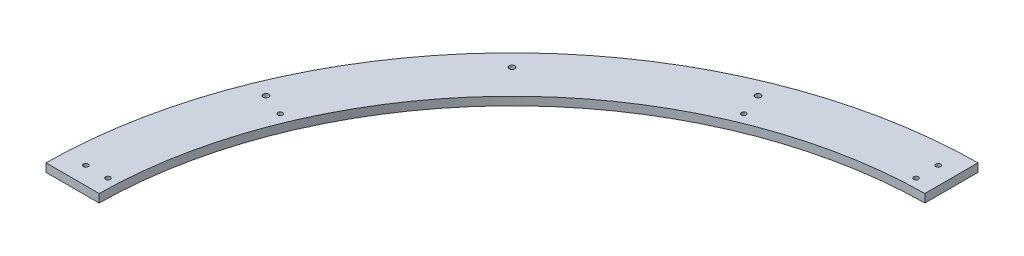
ISO-10303-21;
HEADER;
FILE_DESCRIPTION(('STEP AP214'),'2;1');
FILE_NAME('part.step','',(''),(''),'','','');
FILE_SCHEMA(('AUTOMOTIVE_DESIGN { 1 0 10303 214 1 1 1 1 }'));
ENDSEC;
DATA;
#1=APPLICATION_CONTEXT('core data for automotive mechanical design processes');
#2=APPLICATION_PROTOCOL_DEFINITION('international standard','automotive_design',2000,#1);
#3=PRODUCT_CONTEXT('',#1,'mechanical');
#4=PRODUCT('Part','Part','',(#3));
#5=PRODUCT_RELATED_PRODUCT_CATEGORY('part','',(#4));
#6=PRODUCT_DEFINITION_FORMATION('','',#4);
#7=PRODUCT_DEFINITION_CONTEXT('part definition',#1,'design');
#8=PRODUCT_DEFINITION('design','',#6,#7);
#9=PRODUCT_DEFINITION_SHAPE('','',#8);
#10=(LENGTH_UNIT() NAMED_UNIT(*) SI_UNIT(.MILLI.,.METRE.));
#11=(NAMED_UNIT(*) PLANE_ANGLE_UNIT() SI_UNIT($,.RADIAN.));
#12=(NAMED_UNIT(*) SI_UNIT($,.STERADIAN.) SOLID_ANGLE_UNIT());
#13=UNCERTAINTY_MEASURE_WITH_UNIT(LENGTH_MEASURE(1.E-05),#10,'distance_accuracy_value','');
#14=(GEOMETRIC_REPRESENTATION_CONTEXT(3) GLOBAL_UNCERTAINTY_ASSIGNED_CONTEXT((#13)) GLOBAL_UNIT_ASSIGNED_CONTEXT((#10,
#11,#12)) REPRESENTATION_CONTEXT('',''));
#15=CARTESIAN_POINT('',(0.,0.,0.));
#16=DIRECTION('',(0.,0.,1.));
#17=DIRECTION('',(1.,0.,0.));
#18=AXIS2_PLACEMENT_3D('',#15,#16,#17);
#19=CARTESIAN_POINT('',(0.,11.90625,0.));
#20=DIRECTION('',(0.,-1.,0.));
#21=DIRECTION('',(0.,0.,-1.));
#22=AXIS2_PLACEMENT_3D('',#19,#20,#21);
#23=PLANE('',#22);
#24=CARTESIAN_POINT('',(-459.11559418966,11.90625,-459.11559418966));
#25=DIRECTION('',(0.,1.,0.));
#26=DIRECTION('',(0.,0.,1.));
#27=AXIS2_PLACEMENT_3D('',#24,#25,#26);
#28=CIRCLE('',#27,3.96875000000002);
#29=CARTESIAN_POINT('',(-459.11559418966,11.90625,-455.14684418966));
#30=VERTEX_POINT('',#29);
#31=EDGE_CURVE('E97',#30,#30,#28,.T.);
#32=ORIENTED_EDGE('',*,*,#31,.F.);
#33=EDGE_LOOP('',(#32));
#34=FACE_BOUND('',#33,.T.);
#35=CARTESIAN_POINT('',(-600.276828981566,11.90625,-247.47118265383));
#36=DIRECTION('',(0.,1.,0.));
#37=DIRECTION('',(0.,0.,1.));
#38=AXIS2_PLACEMENT_3D('',#35,#36,#37);
#39=CIRCLE('',#38,3.96874999999997);
#40=CARTESIAN_POINT('',(-600.276828981566,11.90625,-243.50243265383));
#41=VERTEX_POINT('',#40);
#42=EDGE_CURVE('E105',#41,#41,#39,.T.);
#43=ORIENTED_EDGE('',*,*,#42,.F.);
#44=EDGE_LOOP('',(#43));
#45=FACE_BOUND('',#44,.T.);
#46=CARTESIAN_POINT('',(-247.47118265383,11.90625,-600.276828981566));
#47=DIRECTION('',(0.,1.,0.));
#48=DIRECTION('',(0.,0.,1.));
#49=AXIS2_PLACEMENT_3D('',#46,#47,#48);
#50=CIRCLE('',#49,3.96874999999999);
#51=CARTESIAN_POINT('',(-247.47118265383,11.90625,-596.308078981566));
#52=VERTEX_POINT('',#51);
#53=EDGE_CURVE('E111',#52,#52,#50,.T.);
#54=ORIENTED_EDGE('',*,*,#53,.F.);
#55=EDGE_LOOP('',(#54));
#56=FACE_BOUND('',#55,.T.);
#57=CARTESIAN_POINT('',(-31.75,11.90625,-642.9375));
#58=DIRECTION('',(0.,1.,0.));
#59=DIRECTION('',(0.,0.,1.));
#60=AXIS2_PLACEMENT_3D('',#57,#58,#59);
#61=CIRCLE('',#60,3.3782);
#62=CARTESIAN_POINT('',(-31.75,11.90625,-639.5593));
#63=VERTEX_POINT('',#62);
#64=EDGE_CURVE('E117',#63,#63,#61,.T.);
#65=ORIENTED_EDGE('',*,*,#64,.F.);
#66=EDGE_LOOP('',(#65));
#67=FACE_BOUND('',#66,.T.);
#68=CARTESIAN_POINT('',(-31.75,11.90625,-611.1875));
#69=DIRECTION('',(0.,1.,0.));
#70=DIRECTION('',(0.,0.,1.));
#71=AXIS2_PLACEMENT_3D('',#68,#69,#70);
#72=CIRCLE('',#71,3.3782);
#73=CARTESIAN_POINT('',(-31.75,11.90625,-607.8093));
#74=VERTEX_POINT('',#73);
#75=EDGE_CURVE('E123',#74,#74,#72,.T.);
#76=ORIENTED_EDGE('',*,*,#75,.F.);
#77=EDGE_LOOP('',(#76));
#78=FACE_BOUND('',#77,.T.);
#79=CARTESIAN_POINT('',(-611.1875,11.90625,-31.75));
#80=DIRECTION('',(0.,1.,0.));
#81=DIRECTION('',(0.,0.,1.));
#82=AXIS2_PLACEMENT_3D('',#79,#80,#81);
#83=CIRCLE('',#82,3.3782);
#84=CARTESIAN_POINT('',(-611.1875,11.90625,-28.3718));
#85=VERTEX_POINT('',#84);
#86=EDGE_CURVE('E129',#85,#85,#83,.T.);
#87=ORIENTED_EDGE('',*,*,#86,.F.);
#88=EDGE_LOOP('',(#87));
#89=FACE_BOUND('',#88,.T.);
#90=CARTESIAN_POINT('',(-642.9375,11.90625,-31.75));
#91=DIRECTION('',(0.,1.,0.));
#92=DIRECTION('',(0.,0.,1.));
#93=AXIS2_PLACEMENT_3D('',#90,#91,#92);
#94=CIRCLE('',#93,3.3782);
#95=CARTESIAN_POINT('',(-642.9375,11.90625,-28.3718));
#96=VERTEX_POINT('',#95);
#97=EDGE_CURVE('E135',#96,#96,#94,.T.);
#98=ORIENTED_EDGE('',*,*,#97,.F.);
#99=EDGE_LOOP('',(#98));
#100=FACE_BOUND('',#99,.T.);
#101=CARTESIAN_POINT('',(-567.596939292465,11.90625,-235.106350216397));
#102=DIRECTION('',(0.,1.,0.));
#103=DIRECTION('',(0.,0.,1.));
#104=AXIS2_PLACEMENT_3D('',#101,#102,#103);
#105=CIRCLE('',#104,3.3782);
#106=CARTESIAN_POINT('',(-567.596939292465,11.90625,-231.728150216397));
#107=VERTEX_POINT('',#106);
#108=EDGE_CURVE('E141',#107,#107,#105,.T.);
#109=ORIENTED_EDGE('',*,*,#108,.F.);
#110=EDGE_LOOP('',(#109));
#111=FACE_BOUND('',#110,.T.);
#112=DIRECTION('',(0.,0.,1.));
#113=VECTOR('',#112,1.);
#114=CARTESIAN_POINT('',(-6.35,11.90625,-598.453812049226));
#115=LINE('',#114,#113);
#116=CARTESIAN_POINT('',(-6.35,11.90625,-674.657616985275));
#117=VERTEX_POINT('',#116);
#118=CARTESIAN_POINT('',(-6.35,11.90625,-598.453812049226));
#119=VERTEX_POINT('',#118);
#120=EDGE_CURVE('E82',#117,#119,#115,.T.);
#121=ORIENTED_EDGE('',*,*,#120,.F.);
#122=CARTESIAN_POINT('',(0.,11.90625,0.));
#123=DIRECTION('',(0.,1.,0.));
#124=DIRECTION('',(0.,0.,-1.));
#125=AXIS2_PLACEMENT_3D('',#122,#123,#124);
#126=CIRCLE('',#125,674.6875);
#127=CARTESIAN_POINT('',(-674.657616985275,11.90625,-6.34999999999989));
#128=VERTEX_POINT('',#127);
#129=EDGE_CURVE('E11',#117,#128,#126,.T.);
#130=ORIENTED_EDGE('',*,*,#129,.T.);
#131=DIRECTION('',(-1.,0.,0.));
#132=VECTOR('',#131,1.);
#133=CARTESIAN_POINT('',(-598.453812049226,11.90625,-6.34999999999989));
#134=LINE('',#133,#132);
#135=CARTESIAN_POINT('',(-598.453812049226,11.90625,-6.34999999999989));
#136=VERTEX_POINT('',#135);
#137=EDGE_CURVE('E74',#136,#128,#134,.T.);
#138=ORIENTED_EDGE('',*,*,#137,.F.);
#139=CARTESIAN_POINT('',(0.,11.90625,0.));
#140=DIRECTION('',(0.,-1.,0.));
#141=DIRECTION('',(0.,0.,-1.));
#142=AXIS2_PLACEMENT_3D('',#139,#140,#141);
#143=CIRCLE('',#142,598.4875);
#144=EDGE_CURVE('E43',#136,#119,#143,.T.);
#145=ORIENTED_EDGE('',*,*,#144,.T.);
#146=EDGE_LOOP('',(#121,#130,#138,#145));
#147=FACE_BOUND('',#146,.T.);
#148=CARTESIAN_POINT('',(-235.106350216398,11.90625,-567.596939292465));
#149=DIRECTION('',(0.,1.,0.));
#150=DIRECTION('',(0.,0.,1.));
#151=AXIS2_PLACEMENT_3D('',#148,#149,#150);
#152=CIRCLE('',#151,3.3782);
#153=CARTESIAN_POINT('',(-235.106350216398,11.90625,-564.218739292465));
#154=VERTEX_POINT('',#153);
#155=EDGE_CURVE('E147',#154,#154,#152,.T.);
#156=ORIENTED_EDGE('',*,*,#155,.F.);
#157=EDGE_LOOP('',(#156));
#158=FACE_BOUND('',#157,.T.);
#159=ADVANCED_FACE('F33',(#34,#45,#56,#67,#78,#89,#100,#111,#147,#158),#23,.F.);
#160=CARTESIAN_POINT('',(0.,0.,0.));
#161=DIRECTION('',(0.,-1.,0.));
#162=DIRECTION('',(0.,0.,-1.));
#163=AXIS2_PLACEMENT_3D('',#160,#161,#162);
#164=PLANE('',#163);
#165=CARTESIAN_POINT('',(0.,0.,0.));
#166=DIRECTION('',(0.,1.,0.));
#167=DIRECTION('',(0.,0.,-1.));
#168=AXIS2_PLACEMENT_3D('',#165,#166,#167);
#169=CIRCLE('',#168,674.6875);
#170=CARTESIAN_POINT('',(-6.35,0.,-674.657616985275));
#171=VERTEX_POINT('',#170);
#172=CARTESIAN_POINT('',(-674.657616985275,0.,-6.34999999999989));
#173=VERTEX_POINT('',#172);
#174=EDGE_CURVE('E37',#171,#173,#169,.T.);
#175=ORIENTED_EDGE('',*,*,#174,.F.);
#176=DIRECTION('',(0.,0.,1.));
#177=VECTOR('',#176,1.);
#178=CARTESIAN_POINT('',(-6.35,0.,-598.453812049226));
#179=LINE('',#178,#177);
#180=CARTESIAN_POINT('',(-6.35,0.,-598.453812049226));
#181=VERTEX_POINT('',#180);
#182=EDGE_CURVE('E87',#171,#181,#179,.T.);
#183=ORIENTED_EDGE('',*,*,#182,.T.);
#184=CARTESIAN_POINT('',(0.,0.,0.));
#185=DIRECTION('',(0.,-1.,0.));
#186=DIRECTION('',(0.,0.,-1.));
#187=AXIS2_PLACEMENT_3D('',#184,#185,#186);
#188=CIRCLE('',#187,598.4875);
#189=CARTESIAN_POINT('',(-598.453812049226,0.,-6.34999999999989));
#190=VERTEX_POINT('',#189);
#191=EDGE_CURVE('E155',#190,#181,#188,.T.);
#192=ORIENTED_EDGE('',*,*,#191,.F.);
#193=DIRECTION('',(-1.,0.,0.));
#194=VECTOR('',#193,1.);
#195=CARTESIAN_POINT('',(-598.453812049226,0.,-6.34999999999989));
#196=LINE('',#195,#194);
#197=EDGE_CURVE('E64',#190,#173,#196,.T.);
#198=ORIENTED_EDGE('',*,*,#197,.T.);
#199=EDGE_LOOP('',(#175,#183,#192,#198));
#200=FACE_BOUND('',#199,.T.);
#201=CARTESIAN_POINT('',(-459.11559418966,0.,-459.11559418966));
#202=DIRECTION('',(0.,1.,0.));
#203=DIRECTION('',(0.,0.,1.));
#204=AXIS2_PLACEMENT_3D('',#201,#202,#203);
#205=CIRCLE('',#204,3.96875000000002);
#206=CARTESIAN_POINT('',(-459.11559418966,0.,-455.14684418966));
#207=VERTEX_POINT('',#206);
#208=EDGE_CURVE('E100',#207,#207,#205,.T.);
#209=ORIENTED_EDGE('',*,*,#208,.T.);
#210=EDGE_LOOP('',(#209));
#211=FACE_BOUND('',#210,.T.);
#212=CARTESIAN_POINT('',(-600.276828981566,0.,-247.47118265383));
#213=DIRECTION('',(0.,1.,0.));
#214=DIRECTION('',(0.,0.,1.));
#215=AXIS2_PLACEMENT_3D('',#212,#213,#214);
#216=CIRCLE('',#215,3.96874999999997);
#217=CARTESIAN_POINT('',(-600.276828981566,0.,-243.50243265383));
#218=VERTEX_POINT('',#217);
#219=EDGE_CURVE('E108',#218,#218,#216,.T.);
#220=ORIENTED_EDGE('',*,*,#219,.T.);
#221=EDGE_LOOP('',(#220));
#222=FACE_BOUND('',#221,.T.);
#223=CARTESIAN_POINT('',(-247.47118265383,0.,-600.276828981566));
#224=DIRECTION('',(0.,1.,0.));
#225=DIRECTION('',(0.,0.,1.));
#226=AXIS2_PLACEMENT_3D('',#223,#224,#225);
#227=CIRCLE('',#226,3.96874999999999);
#228=CARTESIAN_POINT('',(-247.47118265383,0.,-596.308078981566));
#229=VERTEX_POINT('',#228);
#230=EDGE_CURVE('E114',#229,#229,#227,.T.);
#231=ORIENTED_EDGE('',*,*,#230,.T.);
#232=EDGE_LOOP('',(#231));
#233=FACE_BOUND('',#232,.T.);
#234=CARTESIAN_POINT('',(-31.75,0.,-642.9375));
#235=DIRECTION('',(0.,1.,0.));
#236=DIRECTION('',(0.,0.,1.));
#237=AXIS2_PLACEMENT_3D('',#234,#235,#236);
#238=CIRCLE('',#237,3.3782);
#239=CARTESIAN_POINT('',(-31.75,0.,-639.5593));
#240=VERTEX_POINT('',#239);
#241=EDGE_CURVE('E120',#240,#240,#238,.T.);
#242=ORIENTED_EDGE('',*,*,#241,.T.);
#243=EDGE_LOOP('',(#242));
#244=FACE_BOUND('',#243,.T.);
#245=CARTESIAN_POINT('',(-31.75,0.,-611.1875));
#246=DIRECTION('',(0.,1.,0.));
#247=DIRECTION('',(0.,0.,1.));
#248=AXIS2_PLACEMENT_3D('',#245,#246,#247);
#249=CIRCLE('',#248,3.3782);
#250=CARTESIAN_POINT('',(-31.75,0.,-607.8093));
#251=VERTEX_POINT('',#250);
#252=EDGE_CURVE('E126',#251,#251,#249,.T.);
#253=ORIENTED_EDGE('',*,*,#252,.T.);
#254=EDGE_LOOP('',(#253));
#255=FACE_BOUND('',#254,.T.);
#256=CARTESIAN_POINT('',(-611.1875,0.,-31.75));
#257=DIRECTION('',(0.,1.,0.));
#258=DIRECTION('',(0.,0.,1.));
#259=AXIS2_PLACEMENT_3D('',#256,#257,#258);
#260=CIRCLE('',#259,3.3782);
#261=CARTESIAN_POINT('',(-611.1875,0.,-28.3718));
#262=VERTEX_POINT('',#261);
#263=EDGE_CURVE('E132',#262,#262,#260,.T.);
#264=ORIENTED_EDGE('',*,*,#263,.T.);
#265=EDGE_LOOP('',(#264));
#266=FACE_BOUND('',#265,.T.);
#267=CARTESIAN_POINT('',(-642.9375,0.,-31.75));
#268=DIRECTION('',(0.,1.,0.));
#269=DIRECTION('',(0.,0.,1.));
#270=AXIS2_PLACEMENT_3D('',#267,#268,#269);
#271=CIRCLE('',#270,3.3782);
#272=CARTESIAN_POINT('',(-642.9375,0.,-28.3718));
#273=VERTEX_POINT('',#272);
#274=EDGE_CURVE('E138',#273,#273,#271,.T.);
#275=ORIENTED_EDGE('',*,*,#274,.T.);
#276=EDGE_LOOP('',(#275));
#277=FACE_BOUND('',#276,.T.);
#278=CARTESIAN_POINT('',(-567.596939292465,0.,-235.106350216397));
#279=DIRECTION('',(0.,1.,0.));
#280=DIRECTION('',(0.,0.,1.));
#281=AXIS2_PLACEMENT_3D('',#278,#279,#280);
#282=CIRCLE('',#281,3.3782);
#283=CARTESIAN_POINT('',(-567.596939292465,0.,-231.728150216397));
#284=VERTEX_POINT('',#283);
#285=EDGE_CURVE('E144',#284,#284,#282,.T.);
#286=ORIENTED_EDGE('',*,*,#285,.T.);
#287=EDGE_LOOP('',(#286));
#288=FACE_BOUND('',#287,.T.);
#289=CARTESIAN_POINT('',(-235.106350216398,0.,-567.596939292465));
#290=DIRECTION('',(0.,1.,0.));
#291=DIRECTION('',(0.,0.,1.));
#292=AXIS2_PLACEMENT_3D('',#289,#290,#291);
#293=CIRCLE('',#292,3.3782);
#294=CARTESIAN_POINT('',(-235.106350216398,0.,-564.218739292465));
#295=VERTEX_POINT('',#294);
#296=EDGE_CURVE('E150',#295,#295,#293,.T.);
#297=ORIENTED_EDGE('',*,*,#296,.T.);
#298=EDGE_LOOP('',(#297));
#299=FACE_BOUND('',#298,.T.);
#300=ADVANCED_FACE('F161',(#200,#211,#222,#233,#244,#255,#266,#277,#288,#299),#164,.T.);
#301=CARTESIAN_POINT('',(0.,11.90625,0.));
#302=DIRECTION('',(0.,-1.,0.));
#303=DIRECTION('',(0.,0.,-1.));
#304=AXIS2_PLACEMENT_3D('',#301,#302,#303);
#305=CYLINDRICAL_SURFACE('',#304,598.4875);
#306=ORIENTED_EDGE('',*,*,#191,.T.);
#307=DIRECTION('',(0.,1.,0.));
#308=VECTOR('',#307,1.);
#309=CARTESIAN_POINT('',(-6.35,0.,-598.453812049226));
#310=LINE('',#309,#308);
#311=EDGE_CURVE('E52',#181,#119,#310,.T.);
#312=ORIENTED_EDGE('',*,*,#311,.T.);
#313=ORIENTED_EDGE('',*,*,#144,.F.);
#314=DIRECTION('',(0.,1.,0.));
#315=VECTOR('',#314,1.);
#316=CARTESIAN_POINT('',(-598.453812049226,0.,-6.34999999999989));
#317=LINE('',#316,#315);
#318=EDGE_CURVE('E67',#190,#136,#317,.T.);
#319=ORIENTED_EDGE('',*,*,#318,.F.);
#320=EDGE_LOOP('',(#306,#312,#313,#319));
#321=FACE_BOUND('',#320,.T.);
#322=ADVANCED_FACE('F35',(#321),#305,.F.);
#323=CARTESIAN_POINT('',(0.,11.90625,0.));
#324=DIRECTION('',(0.,-1.,0.));
#325=DIRECTION('',(0.,0.,-1.));
#326=AXIS2_PLACEMENT_3D('',#323,#324,#325);
#327=CYLINDRICAL_SURFACE('',#326,674.6875);
#328=ORIENTED_EDGE('',*,*,#129,.F.);
#329=DIRECTION('',(0.,-1.,0.));
#330=VECTOR('',#329,1.);
#331=CARTESIAN_POINT('',(-6.35,11.90625,-674.657616985275));
#332=LINE('',#331,#330);
#333=EDGE_CURVE('E90',#117,#171,#332,.T.);
#334=ORIENTED_EDGE('',*,*,#333,.T.);
#335=ORIENTED_EDGE('',*,*,#174,.T.);
#336=DIRECTION('',(0.,-1.,0.));
#337=VECTOR('',#336,1.);
#338=CARTESIAN_POINT('',(-674.657616985275,11.90625,-6.34999999999989));
#339=LINE('',#338,#337);
#340=EDGE_CURVE('E94',#173,#128,#339,.F.);
#341=ORIENTED_EDGE('',*,*,#340,.T.);
#342=EDGE_LOOP('',(#328,#334,#335,#341));
#343=FACE_BOUND('',#342,.T.);
#344=ADVANCED_FACE('F96',(#343),#327,.T.);
#345=CARTESIAN_POINT('',(-598.453812049226,0.,-6.34999999999989));
#346=DIRECTION('',(0.,0.,-1.));
#347=DIRECTION('',(-1.,0.,0.));
#348=AXIS2_PLACEMENT_3D('',#345,#346,#347);
#349=PLANE('',#348);
#350=ORIENTED_EDGE('',*,*,#137,.T.);
#351=ORIENTED_EDGE('',*,*,#340,.F.);
#352=ORIENTED_EDGE('',*,*,#197,.F.);
#353=ORIENTED_EDGE('',*,*,#318,.T.);
#354=EDGE_LOOP('',(#350,#351,#352,#353));
#355=FACE_BOUND('',#354,.T.);
#356=ADVANCED_FACE('F197',(#355),#349,.F.);
#357=CARTESIAN_POINT('',(-6.35,0.,-598.453812049226));
#358=DIRECTION('',(-1.,0.,0.));
#359=DIRECTION('',(0.,0.,1.));
#360=AXIS2_PLACEMENT_3D('',#357,#358,#359);
#361=PLANE('',#360);
#362=ORIENTED_EDGE('',*,*,#120,.T.);
#363=ORIENTED_EDGE('',*,*,#311,.F.);
#364=ORIENTED_EDGE('',*,*,#182,.F.);
#365=ORIENTED_EDGE('',*,*,#333,.F.);
#366=EDGE_LOOP('',(#362,#363,#364,#365));
#367=FACE_BOUND('',#366,.T.);
#368=ADVANCED_FACE('F91',(#367),#361,.F.);
#369=CARTESIAN_POINT('',(-235.106350216398,11.90625,-567.596939292465));
#370=DIRECTION('',(0.,1.,0.));
#371=DIRECTION('',(0.,0.,1.));
#372=AXIS2_PLACEMENT_3D('',#369,#370,#371);
#373=CYLINDRICAL_SURFACE('',#372,3.3782);
#374=ORIENTED_EDGE('',*,*,#296,.F.);
#375=EDGE_LOOP('',(#374));
#376=FACE_BOUND('',#375,.T.);
#377=ORIENTED_EDGE('',*,*,#155,.T.);
#378=EDGE_LOOP('',(#377));
#379=FACE_BOUND('',#378,.T.);
#380=ADVANCED_FACE('F183',(#376,#379),#373,.F.);
#381=CARTESIAN_POINT('',(-567.596939292465,11.90625,-235.106350216397));
#382=DIRECTION('',(0.,1.,0.));
#383=DIRECTION('',(0.,0.,1.));
#384=AXIS2_PLACEMENT_3D('',#381,#382,#383);
#385=CYLINDRICAL_SURFACE('',#384,3.3782);
#386=ORIENTED_EDGE('',*,*,#285,.F.);
#387=EDGE_LOOP('',(#386));
#388=FACE_BOUND('',#387,.T.);
#389=ORIENTED_EDGE('',*,*,#108,.T.);
#390=EDGE_LOOP('',(#389));
#391=FACE_BOUND('',#390,.T.);
#392=ADVANCED_FACE('F186',(#388,#391),#385,.F.);
#393=CARTESIAN_POINT('',(-642.9375,11.90625,-31.75));
#394=DIRECTION('',(0.,1.,0.));
#395=DIRECTION('',(0.,0.,1.));
#396=AXIS2_PLACEMENT_3D('',#393,#394,#395);
#397=CYLINDRICAL_SURFACE('',#396,3.3782);
#398=ORIENTED_EDGE('',*,*,#274,.F.);
#399=EDGE_LOOP('',(#398));
#400=FACE_BOUND('',#399,.T.);
#401=ORIENTED_EDGE('',*,*,#97,.T.);
#402=EDGE_LOOP('',(#401));
#403=FACE_BOUND('',#402,.T.);
#404=ADVANCED_FACE('F245',(#400,#403),#397,.F.);
#405=CARTESIAN_POINT('',(-611.1875,11.90625,-31.75));
#406=DIRECTION('',(0.,1.,0.));
#407=DIRECTION('',(0.,0.,1.));
#408=AXIS2_PLACEMENT_3D('',#405,#406,#407);
#409=CYLINDRICAL_SURFACE('',#408,3.3782);
#410=ORIENTED_EDGE('',*,*,#263,.F.);
#411=EDGE_LOOP('',(#410));
#412=FACE_BOUND('',#411,.T.);
#413=ORIENTED_EDGE('',*,*,#86,.T.);
#414=EDGE_LOOP('',(#413));
#415=FACE_BOUND('',#414,.T.);
#416=ADVANCED_FACE('F253',(#412,#415),#409,.F.);
#417=CARTESIAN_POINT('',(-31.75,11.90625,-611.1875));
#418=DIRECTION('',(0.,1.,0.));
#419=DIRECTION('',(0.,0.,1.));
#420=AXIS2_PLACEMENT_3D('',#417,#418,#419);
#421=CYLINDRICAL_SURFACE('',#420,3.3782);
#422=ORIENTED_EDGE('',*,*,#252,.F.);
#423=EDGE_LOOP('',(#422));
#424=FACE_BOUND('',#423,.T.);
#425=ORIENTED_EDGE('',*,*,#75,.T.);
#426=EDGE_LOOP('',(#425));
#427=FACE_BOUND('',#426,.T.);
#428=ADVANCED_FACE('F261',(#424,#427),#421,.F.);
#429=CARTESIAN_POINT('',(-31.75,11.90625,-642.9375));
#430=DIRECTION('',(0.,1.,0.));
#431=DIRECTION('',(0.,0.,1.));
#432=AXIS2_PLACEMENT_3D('',#429,#430,#431);
#433=CYLINDRICAL_SURFACE('',#432,3.3782);
#434=ORIENTED_EDGE('',*,*,#241,.F.);
#435=EDGE_LOOP('',(#434));
#436=FACE_BOUND('',#435,.T.);
#437=ORIENTED_EDGE('',*,*,#64,.T.);
#438=EDGE_LOOP('',(#437));
#439=FACE_BOUND('',#438,.T.);
#440=ADVANCED_FACE('F269',(#436,#439),#433,.F.);
#441=CARTESIAN_POINT('',(-247.47118265383,11.90625,-600.276828981566));
#442=DIRECTION('',(0.,1.,0.));
#443=DIRECTION('',(0.,0.,1.));
#444=AXIS2_PLACEMENT_3D('',#441,#442,#443);
#445=CYLINDRICAL_SURFACE('',#444,3.96874999999999);
#446=ORIENTED_EDGE('',*,*,#230,.F.);
#447=EDGE_LOOP('',(#446));
#448=FACE_BOUND('',#447,.T.);
#449=ORIENTED_EDGE('',*,*,#53,.T.);
#450=EDGE_LOOP('',(#449));
#451=FACE_BOUND('',#450,.T.);
#452=ADVANCED_FACE('F277',(#448,#451),#445,.F.);
#453=CARTESIAN_POINT('',(-600.276828981566,11.90625,-247.47118265383));
#454=DIRECTION('',(0.,1.,0.));
#455=DIRECTION('',(0.,0.,1.));
#456=AXIS2_PLACEMENT_3D('',#453,#454,#455);
#457=CYLINDRICAL_SURFACE('',#456,3.96874999999997);
#458=ORIENTED_EDGE('',*,*,#219,.F.);
#459=EDGE_LOOP('',(#458));
#460=FACE_BOUND('',#459,.T.);
#461=ORIENTED_EDGE('',*,*,#42,.T.);
#462=EDGE_LOOP('',(#461));
#463=FACE_BOUND('',#462,.T.);
#464=ADVANCED_FACE('F285',(#460,#463),#457,.F.);
#465=CARTESIAN_POINT('',(-459.11559418966,11.90625,-459.11559418966));
#466=DIRECTION('',(0.,1.,0.));
#467=DIRECTION('',(0.,0.,1.));
#468=AXIS2_PLACEMENT_3D('',#465,#466,#467);
#469=CYLINDRICAL_SURFACE('',#468,3.96875000000002);
#470=ORIENTED_EDGE('',*,*,#208,.F.);
#471=EDGE_LOOP('',(#470));
#472=FACE_BOUND('',#471,.T.);
#473=ORIENTED_EDGE('',*,*,#31,.T.);
#474=EDGE_LOOP('',(#473));
#475=FACE_BOUND('',#474,.T.);
#476=ADVANCED_FACE('F293',(#472,#475),#469,.F.);
#477=CLOSED_SHELL('',(#159,#300,#322,#344,#356,#368,#380,#392,#404,#416,#428,#440,#452,#464,#476));
#478=MANIFOLD_SOLID_BREP('B2',#477);
#479=ADVANCED_BREP_SHAPE_REPRESENTATION('',(#18,#478),#14);
#480=SHAPE_DEFINITION_REPRESENTATION(#9,#479);
ENDSEC;
END-ISO-10303-21;
